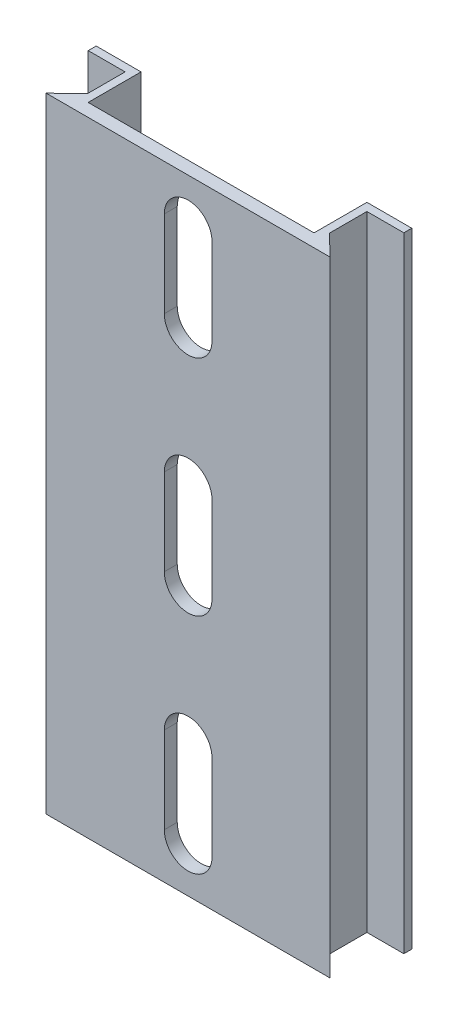
ISO-10303-21;
HEADER;
FILE_DESCRIPTION(('STEP AP214'),'2;1');
FILE_NAME('part.step','',(''),(''),'','','');
FILE_SCHEMA(('AUTOMOTIVE_DESIGN { 1 0 10303 214 1 1 1 1 }'));
ENDSEC;
DATA;
#1=APPLICATION_CONTEXT('core data for automotive mechanical design processes');
#2=APPLICATION_PROTOCOL_DEFINITION('international standard','automotive_design',2000,#1);
#3=PRODUCT_CONTEXT('',#1,'mechanical');
#4=PRODUCT('Part','Part','',(#3));
#5=PRODUCT_RELATED_PRODUCT_CATEGORY('part','',(#4));
#6=PRODUCT_DEFINITION_FORMATION('','',#4);
#7=PRODUCT_DEFINITION_CONTEXT('part definition',#1,'design');
#8=PRODUCT_DEFINITION('design','',#6,#7);
#9=PRODUCT_DEFINITION_SHAPE('','',#8);
#10=(LENGTH_UNIT() NAMED_UNIT(*) SI_UNIT(.MILLI.,.METRE.));
#11=(NAMED_UNIT(*) PLANE_ANGLE_UNIT() SI_UNIT($,.RADIAN.));
#12=(NAMED_UNIT(*) SI_UNIT($,.STERADIAN.) SOLID_ANGLE_UNIT());
#13=UNCERTAINTY_MEASURE_WITH_UNIT(LENGTH_MEASURE(1.E-05),#10,'distance_accuracy_value','');
#14=(GEOMETRIC_REPRESENTATION_CONTEXT(3) GLOBAL_UNCERTAINTY_ASSIGNED_CONTEXT((#13)) GLOBAL_UNIT_ASSIGNED_CONTEXT((#10,
#11,#12)) REPRESENTATION_CONTEXT('',''));
#15=CARTESIAN_POINT('',(0.,0.,0.));
#16=DIRECTION('',(0.,0.,1.));
#17=DIRECTION('',(1.,0.,0.));
#18=AXIS2_PLACEMENT_3D('',#15,#16,#17);
#19=CARTESIAN_POINT('',(0.,34.925,-1.4478));
#20=DIRECTION('',(0.,0.,-1.));
#21=DIRECTION('',(-1.,0.,0.));
#22=AXIS2_PLACEMENT_3D('',#19,#20,#21);
#23=PLANE('',#22);
#24=CARTESIAN_POINT('',(0.,20.167,-1.4478));
#25=DIRECTION('',(0.,0.,-1.));
#26=DIRECTION('',(-1.,0.,0.));
#27=AXIS2_PLACEMENT_3D('',#24,#25,#26);
#28=CIRCLE('',#27,2.667);
#29=CARTESIAN_POINT('',(2.667,20.167,-1.4478));
#30=VERTEX_POINT('',#29);
#31=CARTESIAN_POINT('',(-2.667,20.167,-1.4478));
#32=VERTEX_POINT('',#31);
#33=EDGE_CURVE('E219',#30,#32,#28,.T.);
#34=ORIENTED_EDGE('',*,*,#33,.F.);
#35=DIRECTION('',(0.,-1.,0.));
#36=VECTOR('',#35,1.);
#37=CARTESIAN_POINT('',(2.667,59.925,-1.4478));
#38=LINE('',#37,#36);
#39=CARTESIAN_POINT('',(2.667,29.833,-1.4478));
#40=VERTEX_POINT('',#39);
#41=EDGE_CURVE('E208',#40,#30,#38,.T.);
#42=ORIENTED_EDGE('',*,*,#41,.F.);
#43=CARTESIAN_POINT('',(0.,29.833,-1.4478));
#44=DIRECTION('',(0.,0.,-1.));
#45=DIRECTION('',(-1.,0.,0.));
#46=AXIS2_PLACEMENT_3D('',#43,#44,#45);
#47=CIRCLE('',#46,2.667);
#48=CARTESIAN_POINT('',(-2.667,29.833,-1.4478));
#49=VERTEX_POINT('',#48);
#50=EDGE_CURVE('E49',#49,#40,#47,.T.);
#51=ORIENTED_EDGE('',*,*,#50,.F.);
#52=DIRECTION('',(0.,1.,0.));
#53=VECTOR('',#52,1.);
#54=CARTESIAN_POINT('',(-2.667,59.925,-1.4478));
#55=LINE('',#54,#53);
#56=EDGE_CURVE('E224',#32,#49,#55,.T.);
#57=ORIENTED_EDGE('',*,*,#56,.F.);
#58=EDGE_LOOP('',(#34,#42,#51,#57));
#59=FACE_BOUND('',#58,.T.);
#60=CARTESIAN_POINT('',(0.,-29.833,-1.4478));
#61=DIRECTION('',(0.,0.,-1.));
#62=DIRECTION('',(-1.,0.,0.));
#63=AXIS2_PLACEMENT_3D('',#60,#61,#62);
#64=CIRCLE('',#63,2.667);
#65=CARTESIAN_POINT('',(2.667,-29.833,-1.4478));
#66=VERTEX_POINT('',#65);
#67=CARTESIAN_POINT('',(-2.667,-29.833,-1.4478));
#68=VERTEX_POINT('',#67);
#69=EDGE_CURVE('E257',#66,#68,#64,.T.);
#70=ORIENTED_EDGE('',*,*,#69,.F.);
#71=DIRECTION('',(0.,-1.,0.));
#72=VECTOR('',#71,1.);
#73=CARTESIAN_POINT('',(2.667,9.925,-1.4478));
#74=LINE('',#73,#72);
#75=CARTESIAN_POINT('',(2.667,-20.167,-1.4478));
#76=VERTEX_POINT('',#75);
#77=EDGE_CURVE('E227',#76,#66,#74,.T.);
#78=ORIENTED_EDGE('',*,*,#77,.F.);
#79=CARTESIAN_POINT('',(0.,-20.167,-1.4478));
#80=DIRECTION('',(0.,0.,-1.));
#81=DIRECTION('',(-1.,0.,0.));
#82=AXIS2_PLACEMENT_3D('',#79,#80,#81);
#83=CIRCLE('',#82,2.667);
#84=CARTESIAN_POINT('',(-2.667,-20.167,-1.4478));
#85=VERTEX_POINT('',#84);
#86=EDGE_CURVE('E242',#85,#76,#83,.T.);
#87=ORIENTED_EDGE('',*,*,#86,.F.);
#88=DIRECTION('',(0.,1.,0.));
#89=VECTOR('',#88,1.);
#90=CARTESIAN_POINT('',(-2.667,9.925,-1.4478));
#91=LINE('',#90,#89);
#92=EDGE_CURVE('E249',#68,#85,#91,.T.);
#93=ORIENTED_EDGE('',*,*,#92,.F.);
#94=EDGE_LOOP('',(#70,#78,#87,#93));
#95=FACE_BOUND('',#94,.T.);
#96=CARTESIAN_POINT('',(0.,-4.833,-1.4478));
#97=DIRECTION('',(0.,0.,-1.));
#98=DIRECTION('',(-1.,0.,0.));
#99=AXIS2_PLACEMENT_3D('',#96,#97,#98);
#100=CIRCLE('',#99,2.667);
#101=CARTESIAN_POINT('',(2.667,-4.833,-1.4478));
#102=VERTEX_POINT('',#101);
#103=CARTESIAN_POINT('',(-2.667,-4.833,-1.4478));
#104=VERTEX_POINT('',#103);
#105=EDGE_CURVE('E289',#102,#104,#100,.T.);
#106=ORIENTED_EDGE('',*,*,#105,.F.);
#107=DIRECTION('',(0.,-1.,0.));
#108=VECTOR('',#107,1.);
#109=CARTESIAN_POINT('',(2.667,34.925,-1.4478));
#110=LINE('',#109,#108);
#111=CARTESIAN_POINT('',(2.667,4.833,-1.4478));
#112=VERTEX_POINT('',#111);
#113=EDGE_CURVE('E276',#112,#102,#110,.T.);
#114=ORIENTED_EDGE('',*,*,#113,.F.);
#115=CARTESIAN_POINT('',(0.,4.833,-1.4478));
#116=DIRECTION('',(0.,0.,-1.));
#117=DIRECTION('',(-1.,0.,0.));
#118=AXIS2_PLACEMENT_3D('',#115,#116,#117);
#119=CIRCLE('',#118,2.667);
#120=CARTESIAN_POINT('',(-2.667,4.833,-1.4478));
#121=VERTEX_POINT('',#120);
#122=EDGE_CURVE('E284',#121,#112,#119,.T.);
#123=ORIENTED_EDGE('',*,*,#122,.F.);
#124=DIRECTION('',(0.,1.,0.));
#125=VECTOR('',#124,1.);
#126=CARTESIAN_POINT('',(-2.667,34.925,-1.4478));
#127=LINE('',#126,#125);
#128=EDGE_CURVE('E287',#104,#121,#127,.T.);
#129=ORIENTED_EDGE('',*,*,#128,.F.);
#130=EDGE_LOOP('',(#106,#114,#123,#129));
#131=FACE_BOUND('',#130,.T.);
#132=DIRECTION('',(1.,0.,0.));
#133=VECTOR('',#132,1.);
#134=CARTESIAN_POINT('',(0.,-34.925,-1.4478));
#135=LINE('',#134,#133);
#136=CARTESIAN_POINT('',(-12.6365,-34.925,-1.4478));
#137=VERTEX_POINT('',#136);
#138=CARTESIAN_POINT('',(12.6365,-34.925,-1.4478));
#139=VERTEX_POINT('',#138);
#140=EDGE_CURVE('E291',#137,#139,#135,.T.);
#141=ORIENTED_EDGE('',*,*,#140,.F.);
#142=DIRECTION('',(0.,-1.,0.));
#143=VECTOR('',#142,1.);
#144=CARTESIAN_POINT('',(-12.6365,34.925,-1.4478));
#145=LINE('',#144,#143);
#146=CARTESIAN_POINT('',(-12.6365,34.925,-1.4478));
#147=VERTEX_POINT('',#146);
#148=EDGE_CURVE('E11',#147,#137,#145,.T.);
#149=ORIENTED_EDGE('',*,*,#148,.F.);
#150=DIRECTION('',(1.,0.,0.));
#151=VECTOR('',#150,1.);
#152=CARTESIAN_POINT('',(0.,34.925,-1.4478));
#153=LINE('',#152,#151);
#154=CARTESIAN_POINT('',(12.6365,34.925,-1.4478));
#155=VERTEX_POINT('',#154);
#156=EDGE_CURVE('E292',#147,#155,#153,.T.);
#157=ORIENTED_EDGE('',*,*,#156,.T.);
#158=DIRECTION('',(0.,-1.,0.));
#159=VECTOR('',#158,1.);
#160=CARTESIAN_POINT('',(12.6365,34.925,-1.4478));
#161=LINE('',#160,#159);
#162=EDGE_CURVE('E329',#155,#139,#161,.T.);
#163=ORIENTED_EDGE('',*,*,#162,.T.);
#164=EDGE_LOOP('',(#141,#149,#157,#163));
#165=FACE_BOUND('',#164,.T.);
#166=ADVANCED_FACE('F35',(#59,#95,#131,#165),#23,.T.);
#167=CARTESIAN_POINT('',(-12.6365,34.925,0.));
#168=DIRECTION('',(-1.,0.,0.));
#169=DIRECTION('',(0.,0.,1.));
#170=AXIS2_PLACEMENT_3D('',#167,#168,#169);
#171=PLANE('',#170);
#172=DIRECTION('',(0.,0.,-1.));
#173=VECTOR('',#172,1.);
#174=CARTESIAN_POINT('',(-12.6365,-34.925,0.));
#175=LINE('',#174,#173);
#176=CARTESIAN_POINT('',(-12.6365,-34.925,-7.366));
#177=VERTEX_POINT('',#176);
#178=EDGE_CURVE('E332',#137,#177,#175,.T.);
#179=ORIENTED_EDGE('',*,*,#178,.T.);
#180=DIRECTION('',(0.,-1.,0.));
#181=VECTOR('',#180,1.);
#182=CARTESIAN_POINT('',(-12.6365,34.925,-7.366));
#183=LINE('',#182,#181);
#184=CARTESIAN_POINT('',(-12.6365,34.925,-7.366));
#185=VERTEX_POINT('',#184);
#186=EDGE_CURVE('E42',#185,#177,#183,.T.);
#187=ORIENTED_EDGE('',*,*,#186,.F.);
#188=DIRECTION('',(0.,0.,-1.));
#189=VECTOR('',#188,1.);
#190=CARTESIAN_POINT('',(-12.6365,34.925,0.));
#191=LINE('',#190,#189);
#192=EDGE_CURVE('E295',#147,#185,#191,.T.);
#193=ORIENTED_EDGE('',*,*,#192,.F.);
#194=ORIENTED_EDGE('',*,*,#148,.T.);
#195=EDGE_LOOP('',(#179,#187,#193,#194));
#196=FACE_BOUND('',#195,.T.);
#197=ADVANCED_FACE('F421',(#196),#171,.F.);
#198=CARTESIAN_POINT('',(0.,34.925,-7.366));
#199=DIRECTION('',(0.,0.,1.));
#200=DIRECTION('',(1.,0.,0.));
#201=AXIS2_PLACEMENT_3D('',#198,#199,#200);
#202=PLANE('',#201);
#203=DIRECTION('',(-1.,0.,0.));
#204=VECTOR('',#203,1.);
#205=CARTESIAN_POINT('',(0.,-34.925,-7.366));
#206=LINE('',#205,#204);
#207=CARTESIAN_POINT('',(-17.653,-34.925,-7.366));
#208=VERTEX_POINT('',#207);
#209=EDGE_CURVE('E334',#177,#208,#206,.T.);
#210=ORIENTED_EDGE('',*,*,#209,.T.);
#211=DIRECTION('',(0.,-1.,0.));
#212=VECTOR('',#211,1.);
#213=CARTESIAN_POINT('',(-17.653,34.925,-7.366));
#214=LINE('',#213,#212);
#215=CARTESIAN_POINT('',(-17.653,34.925,-7.366));
#216=VERTEX_POINT('',#215);
#217=EDGE_CURVE('E389',#216,#208,#214,.T.);
#218=ORIENTED_EDGE('',*,*,#217,.F.);
#219=DIRECTION('',(-1.,0.,0.));
#220=VECTOR('',#219,1.);
#221=CARTESIAN_POINT('',(0.,34.925,-7.366));
#222=LINE('',#221,#220);
#223=EDGE_CURVE('E298',#185,#216,#222,.T.);
#224=ORIENTED_EDGE('',*,*,#223,.F.);
#225=ORIENTED_EDGE('',*,*,#186,.T.);
#226=EDGE_LOOP('',(#210,#218,#224,#225));
#227=FACE_BOUND('',#226,.T.);
#228=ADVANCED_FACE('F396',(#227),#202,.F.);
#229=CARTESIAN_POINT('',(-17.653,34.925,0.));
#230=DIRECTION('',(1.,0.,0.));
#231=DIRECTION('',(0.,0.,-1.));
#232=AXIS2_PLACEMENT_3D('',#229,#230,#231);
#233=PLANE('',#232);
#234=DIRECTION('',(0.,0.,1.));
#235=VECTOR('',#234,1.);
#236=CARTESIAN_POINT('',(-17.653,-34.925,0.));
#237=LINE('',#236,#235);
#238=CARTESIAN_POINT('',(-17.653,-34.925,-6.477));
#239=VERTEX_POINT('',#238);
#240=EDGE_CURVE('E336',#208,#239,#237,.T.);
#241=ORIENTED_EDGE('',*,*,#240,.T.);
#242=DIRECTION('',(0.,-1.,0.));
#243=VECTOR('',#242,1.);
#244=CARTESIAN_POINT('',(-17.653,34.925,-6.477));
#245=LINE('',#244,#243);
#246=CARTESIAN_POINT('',(-17.653,34.925,-6.477));
#247=VERTEX_POINT('',#246);
#248=EDGE_CURVE('E386',#247,#239,#245,.T.);
#249=ORIENTED_EDGE('',*,*,#248,.F.);
#250=DIRECTION('',(0.,0.,1.));
#251=VECTOR('',#250,1.);
#252=CARTESIAN_POINT('',(-17.653,34.925,0.));
#253=LINE('',#252,#251);
#254=EDGE_CURVE('E300',#216,#247,#253,.T.);
#255=ORIENTED_EDGE('',*,*,#254,.F.);
#256=ORIENTED_EDGE('',*,*,#217,.T.);
#257=EDGE_LOOP('',(#241,#249,#255,#256));
#258=FACE_BOUND('',#257,.T.);
#259=ADVANCED_FACE('F409',(#258),#233,.F.);
#260=CARTESIAN_POINT('',(0.,34.925,-6.477));
#261=DIRECTION('',(0.,0.,-1.));
#262=DIRECTION('',(-1.,0.,0.));
#263=AXIS2_PLACEMENT_3D('',#260,#261,#262);
#264=PLANE('',#263);
#265=DIRECTION('',(1.,0.,0.));
#266=VECTOR('',#265,1.);
#267=CARTESIAN_POINT('',(0.,-34.925,-6.477));
#268=LINE('',#267,#266);
#269=CARTESIAN_POINT('',(-13.5255,-34.925,-6.477));
#270=VERTEX_POINT('',#269);
#271=EDGE_CURVE('E338',#239,#270,#268,.T.);
#272=ORIENTED_EDGE('',*,*,#271,.T.);
#273=DIRECTION('',(0.,-1.,0.));
#274=VECTOR('',#273,1.);
#275=CARTESIAN_POINT('',(-13.5255,34.925,-6.477));
#276=LINE('',#275,#274);
#277=CARTESIAN_POINT('',(-13.5255,34.925,-6.477));
#278=VERTEX_POINT('',#277);
#279=EDGE_CURVE('E383',#278,#270,#276,.T.);
#280=ORIENTED_EDGE('',*,*,#279,.F.);
#281=DIRECTION('',(1.,0.,0.));
#282=VECTOR('',#281,1.);
#283=CARTESIAN_POINT('',(0.,34.925,-6.477));
#284=LINE('',#283,#282);
#285=EDGE_CURVE('E302',#247,#278,#284,.T.);
#286=ORIENTED_EDGE('',*,*,#285,.F.);
#287=ORIENTED_EDGE('',*,*,#248,.T.);
#288=EDGE_LOOP('',(#272,#280,#286,#287));
#289=FACE_BOUND('',#288,.T.);
#290=ADVANCED_FACE('F413',(#289),#264,.F.);
#291=CARTESIAN_POINT('',(-13.5255,34.925,0.));
#292=DIRECTION('',(1.,0.,0.));
#293=DIRECTION('',(0.,0.,-1.));
#294=AXIS2_PLACEMENT_3D('',#291,#292,#293);
#295=PLANE('',#294);
#296=DIRECTION('',(0.,0.,1.));
#297=VECTOR('',#296,1.);
#298=CARTESIAN_POINT('',(-13.5255,-34.925,0.));
#299=LINE('',#298,#297);
#300=CARTESIAN_POINT('',(-13.5255,-34.925,-2.286));
#301=VERTEX_POINT('',#300);
#302=EDGE_CURVE('E340',#270,#301,#299,.T.);
#303=ORIENTED_EDGE('',*,*,#302,.T.);
#304=DIRECTION('',(0.,-1.,0.));
#305=VECTOR('',#304,1.);
#306=CARTESIAN_POINT('',(-13.5255,34.925,-2.286));
#307=LINE('',#306,#305);
#308=CARTESIAN_POINT('',(-13.5255,34.925,-2.286));
#309=VERTEX_POINT('',#308);
#310=EDGE_CURVE('E380',#309,#301,#307,.T.);
#311=ORIENTED_EDGE('',*,*,#310,.F.);
#312=DIRECTION('',(0.,0.,1.));
#313=VECTOR('',#312,1.);
#314=CARTESIAN_POINT('',(-13.5255,34.925,0.));
#315=LINE('',#314,#313);
#316=EDGE_CURVE('E304',#278,#309,#315,.T.);
#317=ORIENTED_EDGE('',*,*,#316,.F.);
#318=ORIENTED_EDGE('',*,*,#279,.T.);
#319=EDGE_LOOP('',(#303,#311,#317,#318));
#320=FACE_BOUND('',#319,.T.);
#321=ADVANCED_FACE('F456',(#320),#295,.F.);
#322=CARTESIAN_POINT('',(-7.72007504690431,34.925,-7.93452157598499));
#323=DIRECTION('',(0.697354959803454,0.,0.716725930909106));
#324=DIRECTION('',(0.716725930909106,0.,-0.697354959803454));
#325=AXIS2_PLACEMENT_3D('',#322,#323,#324);
#326=PLANE('',#325);
#327=DIRECTION('',(-0.716725930909106,0.,0.697354959803454));
#328=VECTOR('',#327,1.);
#329=CARTESIAN_POINT('',(-7.72007504690431,-34.925,-7.93452157598499));
#330=LINE('',#329,#328);
#331=CARTESIAN_POINT('',(-15.875,-34.925,0.));
#332=VERTEX_POINT('',#331);
#333=EDGE_CURVE('E342',#301,#332,#330,.T.);
#334=ORIENTED_EDGE('',*,*,#333,.T.);
#335=DIRECTION('',(0.,-1.,0.));
#336=VECTOR('',#335,1.);
#337=CARTESIAN_POINT('',(-15.875,34.925,0.));
#338=LINE('',#337,#336);
#339=CARTESIAN_POINT('',(-15.875,34.925,0.));
#340=VERTEX_POINT('',#339);
#341=EDGE_CURVE('E378',#340,#332,#338,.T.);
#342=ORIENTED_EDGE('',*,*,#341,.F.);
#343=DIRECTION('',(-0.716725930909106,0.,0.697354959803454));
#344=VECTOR('',#343,1.);
#345=CARTESIAN_POINT('',(-7.72007504690431,34.925,-7.93452157598499));
#346=LINE('',#345,#344);
#347=EDGE_CURVE('E306',#309,#340,#346,.T.);
#348=ORIENTED_EDGE('',*,*,#347,.F.);
#349=ORIENTED_EDGE('',*,*,#310,.T.);
#350=EDGE_LOOP('',(#334,#342,#348,#349));
#351=FACE_BOUND('',#350,.T.);
#352=ADVANCED_FACE('F454',(#351),#326,.F.);
#353=CARTESIAN_POINT('',(0.,34.925,0.));
#354=DIRECTION('',(0.,0.,1.));
#355=DIRECTION('',(1.,0.,0.));
#356=AXIS2_PLACEMENT_3D('',#353,#354,#355);
#357=PLANE('',#356);
#358=CARTESIAN_POINT('',(0.,20.167,0.));
#359=DIRECTION('',(0.,0.,1.));
#360=DIRECTION('',(1.,0.,0.));
#361=AXIS2_PLACEMENT_3D('',#358,#359,#360);
#362=CIRCLE('',#361,2.667);
#363=CARTESIAN_POINT('',(-2.667,20.167,0.));
#364=VERTEX_POINT('',#363);
#365=CARTESIAN_POINT('',(2.667,20.167,0.));
#366=VERTEX_POINT('',#365);
#367=EDGE_CURVE('E57',#364,#366,#362,.T.);
#368=ORIENTED_EDGE('',*,*,#367,.F.);
#369=DIRECTION('',(0.,-1.,0.));
#370=VECTOR('',#369,1.);
#371=CARTESIAN_POINT('',(-2.667,20.167,0.));
#372=LINE('',#371,#370);
#373=CARTESIAN_POINT('',(-2.667,29.833,0.));
#374=VERTEX_POINT('',#373);
#375=EDGE_CURVE('E229',#374,#364,#372,.T.);
#376=ORIENTED_EDGE('',*,*,#375,.F.);
#377=CARTESIAN_POINT('',(0.,29.833,0.));
#378=DIRECTION('',(0.,0.,1.));
#379=DIRECTION('',(1.,0.,0.));
#380=AXIS2_PLACEMENT_3D('',#377,#378,#379);
#381=CIRCLE('',#380,2.667);
#382=CARTESIAN_POINT('',(2.667,29.833,0.));
#383=VERTEX_POINT('',#382);
#384=EDGE_CURVE('E696',#383,#374,#381,.T.);
#385=ORIENTED_EDGE('',*,*,#384,.F.);
#386=DIRECTION('',(0.,1.,0.));
#387=VECTOR('',#386,1.);
#388=CARTESIAN_POINT('',(2.667,20.167,0.));
#389=LINE('',#388,#387);
#390=EDGE_CURVE('E215',#366,#383,#389,.T.);
#391=ORIENTED_EDGE('',*,*,#390,.F.);
#392=EDGE_LOOP('',(#368,#376,#385,#391));
#393=FACE_BOUND('',#392,.T.);
#394=CARTESIAN_POINT('',(0.,-29.833,0.));
#395=DIRECTION('',(0.,0.,1.));
#396=DIRECTION('',(1.,0.,0.));
#397=AXIS2_PLACEMENT_3D('',#394,#395,#396);
#398=CIRCLE('',#397,2.667);
#399=CARTESIAN_POINT('',(-2.667,-29.833,0.));
#400=VERTEX_POINT('',#399);
#401=CARTESIAN_POINT('',(2.667,-29.833,0.));
#402=VERTEX_POINT('',#401);
#403=EDGE_CURVE('E260',#400,#402,#398,.T.);
#404=ORIENTED_EDGE('',*,*,#403,.F.);
#405=DIRECTION('',(0.,-1.,0.));
#406=VECTOR('',#405,1.);
#407=CARTESIAN_POINT('',(-2.667,-29.833,0.));
#408=LINE('',#407,#406);
#409=CARTESIAN_POINT('',(-2.667,-20.167,0.));
#410=VERTEX_POINT('',#409);
#411=EDGE_CURVE('E252',#410,#400,#408,.T.);
#412=ORIENTED_EDGE('',*,*,#411,.F.);
#413=CARTESIAN_POINT('',(0.,-20.167,0.));
#414=DIRECTION('',(0.,0.,1.));
#415=DIRECTION('',(1.,0.,0.));
#416=AXIS2_PLACEMENT_3D('',#413,#414,#415);
#417=CIRCLE('',#416,2.667);
#418=CARTESIAN_POINT('',(2.667,-20.167,0.));
#419=VERTEX_POINT('',#418);
#420=EDGE_CURVE('E244',#419,#410,#417,.T.);
#421=ORIENTED_EDGE('',*,*,#420,.F.);
#422=DIRECTION('',(0.,1.,0.));
#423=VECTOR('',#422,1.);
#424=CARTESIAN_POINT('',(2.667,-29.833,0.));
#425=LINE('',#424,#423);
#426=EDGE_CURVE('E234',#402,#419,#425,.T.);
#427=ORIENTED_EDGE('',*,*,#426,.F.);
#428=EDGE_LOOP('',(#404,#412,#421,#427));
#429=FACE_BOUND('',#428,.T.);
#430=CARTESIAN_POINT('',(0.,-4.833,0.));
#431=DIRECTION('',(0.,0.,1.));
#432=DIRECTION('',(1.,0.,0.));
#433=AXIS2_PLACEMENT_3D('',#430,#431,#432);
#434=CIRCLE('',#433,2.667);
#435=CARTESIAN_POINT('',(-2.667,-4.833,0.));
#436=VERTEX_POINT('',#435);
#437=CARTESIAN_POINT('',(2.667,-4.833,0.));
#438=VERTEX_POINT('',#437);
#439=EDGE_CURVE('E262',#436,#438,#434,.T.);
#440=ORIENTED_EDGE('',*,*,#439,.F.);
#441=DIRECTION('',(0.,-1.,0.));
#442=VECTOR('',#441,1.);
#443=CARTESIAN_POINT('',(-2.667,-4.833,0.));
#444=LINE('',#443,#442);
#445=CARTESIAN_POINT('',(-2.667,4.833,0.));
#446=VERTEX_POINT('',#445);
#447=EDGE_CURVE('E270',#446,#436,#444,.T.);
#448=ORIENTED_EDGE('',*,*,#447,.F.);
#449=CARTESIAN_POINT('',(0.,4.833,0.));
#450=DIRECTION('',(0.,0.,1.));
#451=DIRECTION('',(1.,0.,0.));
#452=AXIS2_PLACEMENT_3D('',#449,#450,#451);
#453=CIRCLE('',#452,2.667);
#454=CARTESIAN_POINT('',(2.667,4.833,0.));
#455=VERTEX_POINT('',#454);
#456=EDGE_CURVE('E267',#455,#446,#453,.T.);
#457=ORIENTED_EDGE('',*,*,#456,.F.);
#458=DIRECTION('',(0.,1.,0.));
#459=VECTOR('',#458,1.);
#460=CARTESIAN_POINT('',(2.667,-4.833,0.));
#461=LINE('',#460,#459);
#462=EDGE_CURVE('E264',#438,#455,#461,.T.);
#463=ORIENTED_EDGE('',*,*,#462,.F.);
#464=EDGE_LOOP('',(#440,#448,#457,#463));
#465=FACE_BOUND('',#464,.T.);
#466=DIRECTION('',(-1.,0.,0.));
#467=VECTOR('',#466,1.);
#468=CARTESIAN_POINT('',(0.,-34.925,0.));
#469=LINE('',#468,#467);
#470=CARTESIAN_POINT('',(15.875,-34.925,0.));
#471=VERTEX_POINT('',#470);
#472=EDGE_CURVE('E345',#471,#332,#469,.T.);
#473=ORIENTED_EDGE('',*,*,#472,.F.);
#474=DIRECTION('',(0.,-1.,0.));
#475=VECTOR('',#474,1.);
#476=CARTESIAN_POINT('',(15.875,34.925,0.));
#477=LINE('',#476,#475);
#478=CARTESIAN_POINT('',(15.875,34.925,0.));
#479=VERTEX_POINT('',#478);
#480=EDGE_CURVE('E376',#479,#471,#477,.T.);
#481=ORIENTED_EDGE('',*,*,#480,.F.);
#482=DIRECTION('',(-1.,0.,0.));
#483=VECTOR('',#482,1.);
#484=CARTESIAN_POINT('',(0.,34.925,0.));
#485=LINE('',#484,#483);
#486=EDGE_CURVE('E308',#479,#340,#485,.T.);
#487=ORIENTED_EDGE('',*,*,#486,.T.);
#488=ORIENTED_EDGE('',*,*,#341,.T.);
#489=EDGE_LOOP('',(#473,#481,#487,#488));
#490=FACE_BOUND('',#489,.T.);
#491=ADVANCED_FACE('F450',(#393,#429,#465,#490),#357,.T.);
#492=CARTESIAN_POINT('',(7.72007504690431,34.925,-7.93452157598499));
#493=DIRECTION('',(0.697354959803454,0.,-0.716725930909106));
#494=DIRECTION('',(-0.716725930909106,0.,-0.697354959803454));
#495=AXIS2_PLACEMENT_3D('',#492,#493,#494);
#496=PLANE('',#495);
#497=DIRECTION('',(0.716725930909106,0.,0.697354959803454));
#498=VECTOR('',#497,1.);
#499=CARTESIAN_POINT('',(7.72007504690431,-34.925,-7.93452157598499));
#500=LINE('',#499,#498);
#501=CARTESIAN_POINT('',(13.5255,-34.925,-2.286));
#502=VERTEX_POINT('',#501);
#503=EDGE_CURVE('E348',#502,#471,#500,.T.);
#504=ORIENTED_EDGE('',*,*,#503,.F.);
#505=DIRECTION('',(0.,-1.,0.));
#506=VECTOR('',#505,1.);
#507=CARTESIAN_POINT('',(13.5255,34.925,-2.286));
#508=LINE('',#507,#506);
#509=CARTESIAN_POINT('',(13.5255,34.925,-2.286));
#510=VERTEX_POINT('',#509);
#511=EDGE_CURVE('E374',#510,#502,#508,.T.);
#512=ORIENTED_EDGE('',*,*,#511,.F.);
#513=DIRECTION('',(0.716725930909106,0.,0.697354959803454));
#514=VECTOR('',#513,1.);
#515=CARTESIAN_POINT('',(7.72007504690431,34.925,-7.93452157598499));
#516=LINE('',#515,#514);
#517=EDGE_CURVE('E311',#510,#479,#516,.T.);
#518=ORIENTED_EDGE('',*,*,#517,.T.);
#519=ORIENTED_EDGE('',*,*,#480,.T.);
#520=EDGE_LOOP('',(#504,#512,#518,#519));
#521=FACE_BOUND('',#520,.T.);
#522=ADVANCED_FACE('F446',(#521),#496,.T.);
#523=CARTESIAN_POINT('',(13.5255,34.925,0.));
#524=DIRECTION('',(1.,0.,0.));
#525=DIRECTION('',(0.,0.,-1.));
#526=AXIS2_PLACEMENT_3D('',#523,#524,#525);
#527=PLANE('',#526);
#528=DIRECTION('',(0.,0.,1.));
#529=VECTOR('',#528,1.);
#530=CARTESIAN_POINT('',(13.5255,-34.925,0.));
#531=LINE('',#530,#529);
#532=CARTESIAN_POINT('',(13.5255,-34.925,-6.477));
#533=VERTEX_POINT('',#532);
#534=EDGE_CURVE('E351',#533,#502,#531,.T.);
#535=ORIENTED_EDGE('',*,*,#534,.F.);
#536=DIRECTION('',(0.,-1.,0.));
#537=VECTOR('',#536,1.);
#538=CARTESIAN_POINT('',(13.5255,34.925,-6.477));
#539=LINE('',#538,#537);
#540=CARTESIAN_POINT('',(13.5255,34.925,-6.477));
#541=VERTEX_POINT('',#540);
#542=EDGE_CURVE('E372',#541,#533,#539,.T.);
#543=ORIENTED_EDGE('',*,*,#542,.F.);
#544=DIRECTION('',(0.,0.,1.));
#545=VECTOR('',#544,1.);
#546=CARTESIAN_POINT('',(13.5255,34.925,0.));
#547=LINE('',#546,#545);
#548=EDGE_CURVE('E314',#541,#510,#547,.T.);
#549=ORIENTED_EDGE('',*,*,#548,.T.);
#550=ORIENTED_EDGE('',*,*,#511,.T.);
#551=EDGE_LOOP('',(#535,#543,#549,#550));
#552=FACE_BOUND('',#551,.T.);
#553=ADVANCED_FACE('F441',(#552),#527,.T.);
#554=CARTESIAN_POINT('',(0.,34.925,-6.477));
#555=DIRECTION('',(0.,0.,1.));
#556=DIRECTION('',(1.,0.,0.));
#557=AXIS2_PLACEMENT_3D('',#554,#555,#556);
#558=PLANE('',#557);
#559=DIRECTION('',(-1.,0.,0.));
#560=VECTOR('',#559,1.);
#561=CARTESIAN_POINT('',(0.,-34.925,-6.477));
#562=LINE('',#561,#560);
#563=CARTESIAN_POINT('',(17.653,-34.925,-6.477));
#564=VERTEX_POINT('',#563);
#565=EDGE_CURVE('E354',#564,#533,#562,.T.);
#566=ORIENTED_EDGE('',*,*,#565,.F.);
#567=DIRECTION('',(0.,-1.,0.));
#568=VECTOR('',#567,1.);
#569=CARTESIAN_POINT('',(17.653,34.925,-6.477));
#570=LINE('',#569,#568);
#571=CARTESIAN_POINT('',(17.653,34.925,-6.477));
#572=VERTEX_POINT('',#571);
#573=EDGE_CURVE('E370',#572,#564,#570,.T.);
#574=ORIENTED_EDGE('',*,*,#573,.F.);
#575=DIRECTION('',(-1.,0.,0.));
#576=VECTOR('',#575,1.);
#577=CARTESIAN_POINT('',(0.,34.925,-6.477));
#578=LINE('',#577,#576);
#579=EDGE_CURVE('E317',#572,#541,#578,.T.);
#580=ORIENTED_EDGE('',*,*,#579,.T.);
#581=ORIENTED_EDGE('',*,*,#542,.T.);
#582=EDGE_LOOP('',(#566,#574,#580,#581));
#583=FACE_BOUND('',#582,.T.);
#584=ADVANCED_FACE('F437',(#583),#558,.T.);
#585=CARTESIAN_POINT('',(17.653,34.925,0.));
#586=DIRECTION('',(1.,0.,0.));
#587=DIRECTION('',(0.,0.,-1.));
#588=AXIS2_PLACEMENT_3D('',#585,#586,#587);
#589=PLANE('',#588);
#590=DIRECTION('',(0.,0.,1.));
#591=VECTOR('',#590,1.);
#592=CARTESIAN_POINT('',(17.653,-34.925,0.));
#593=LINE('',#592,#591);
#594=CARTESIAN_POINT('',(17.653,-34.925,-7.366));
#595=VERTEX_POINT('',#594);
#596=EDGE_CURVE('E357',#595,#564,#593,.T.);
#597=ORIENTED_EDGE('',*,*,#596,.F.);
#598=DIRECTION('',(0.,-1.,0.));
#599=VECTOR('',#598,1.);
#600=CARTESIAN_POINT('',(17.653,34.925,-7.366));
#601=LINE('',#600,#599);
#602=CARTESIAN_POINT('',(17.653,34.925,-7.366));
#603=VERTEX_POINT('',#602);
#604=EDGE_CURVE('E368',#603,#595,#601,.T.);
#605=ORIENTED_EDGE('',*,*,#604,.F.);
#606=DIRECTION('',(0.,0.,1.));
#607=VECTOR('',#606,1.);
#608=CARTESIAN_POINT('',(17.653,34.925,0.));
#609=LINE('',#608,#607);
#610=EDGE_CURVE('E320',#603,#572,#609,.T.);
#611=ORIENTED_EDGE('',*,*,#610,.T.);
#612=ORIENTED_EDGE('',*,*,#573,.T.);
#613=EDGE_LOOP('',(#597,#605,#611,#612));
#614=FACE_BOUND('',#613,.T.);
#615=ADVANCED_FACE('F433',(#614),#589,.T.);
#616=CARTESIAN_POINT('',(0.,34.925,-7.366));
#617=DIRECTION('',(0.,0.,-1.));
#618=DIRECTION('',(-1.,0.,0.));
#619=AXIS2_PLACEMENT_3D('',#616,#617,#618);
#620=PLANE('',#619);
#621=DIRECTION('',(1.,0.,0.));
#622=VECTOR('',#621,1.);
#623=CARTESIAN_POINT('',(0.,-34.925,-7.366));
#624=LINE('',#623,#622);
#625=CARTESIAN_POINT('',(12.6365,-34.925,-7.366));
#626=VERTEX_POINT('',#625);
#627=EDGE_CURVE('E360',#626,#595,#624,.T.);
#628=ORIENTED_EDGE('',*,*,#627,.F.);
#629=DIRECTION('',(0.,-1.,0.));
#630=VECTOR('',#629,1.);
#631=CARTESIAN_POINT('',(12.6365,34.925,-7.366));
#632=LINE('',#631,#630);
#633=CARTESIAN_POINT('',(12.6365,34.925,-7.366));
#634=VERTEX_POINT('',#633);
#635=EDGE_CURVE('E366',#634,#626,#632,.T.);
#636=ORIENTED_EDGE('',*,*,#635,.F.);
#637=DIRECTION('',(1.,0.,0.));
#638=VECTOR('',#637,1.);
#639=CARTESIAN_POINT('',(0.,34.925,-7.366));
#640=LINE('',#639,#638);
#641=EDGE_CURVE('E323',#634,#603,#640,.T.);
#642=ORIENTED_EDGE('',*,*,#641,.T.);
#643=ORIENTED_EDGE('',*,*,#604,.T.);
#644=EDGE_LOOP('',(#628,#636,#642,#643));
#645=FACE_BOUND('',#644,.T.);
#646=ADVANCED_FACE('F429',(#645),#620,.T.);
#647=CARTESIAN_POINT('',(12.6365,34.925,0.));
#648=DIRECTION('',(-1.,0.,0.));
#649=DIRECTION('',(0.,0.,1.));
#650=AXIS2_PLACEMENT_3D('',#647,#648,#649);
#651=PLANE('',#650);
#652=DIRECTION('',(0.,0.,-1.));
#653=VECTOR('',#652,1.);
#654=CARTESIAN_POINT('',(12.6365,-34.925,0.));
#655=LINE('',#654,#653);
#656=EDGE_CURVE('E296',#139,#626,#655,.T.);
#657=ORIENTED_EDGE('',*,*,#656,.F.);
#658=ORIENTED_EDGE('',*,*,#162,.F.);
#659=DIRECTION('',(0.,0.,-1.));
#660=VECTOR('',#659,1.);
#661=CARTESIAN_POINT('',(12.6365,34.925,0.));
#662=LINE('',#661,#660);
#663=EDGE_CURVE('E326',#155,#634,#662,.T.);
#664=ORIENTED_EDGE('',*,*,#663,.T.);
#665=ORIENTED_EDGE('',*,*,#635,.T.);
#666=EDGE_LOOP('',(#657,#658,#664,#665));
#667=FACE_BOUND('',#666,.T.);
#668=ADVANCED_FACE('F425',(#667),#651,.T.);
#669=CARTESIAN_POINT('',(0.,34.925,0.));
#670=DIRECTION('',(0.,1.,0.));
#671=DIRECTION('',(0.,0.,1.));
#672=AXIS2_PLACEMENT_3D('',#669,#670,#671);
#673=PLANE('',#672);
#674=ORIENTED_EDGE('',*,*,#156,.F.);
#675=ORIENTED_EDGE('',*,*,#192,.T.);
#676=ORIENTED_EDGE('',*,*,#223,.T.);
#677=ORIENTED_EDGE('',*,*,#254,.T.);
#678=ORIENTED_EDGE('',*,*,#285,.T.);
#679=ORIENTED_EDGE('',*,*,#316,.T.);
#680=ORIENTED_EDGE('',*,*,#347,.T.);
#681=ORIENTED_EDGE('',*,*,#486,.F.);
#682=ORIENTED_EDGE('',*,*,#517,.F.);
#683=ORIENTED_EDGE('',*,*,#548,.F.);
#684=ORIENTED_EDGE('',*,*,#579,.F.);
#685=ORIENTED_EDGE('',*,*,#610,.F.);
#686=ORIENTED_EDGE('',*,*,#641,.F.);
#687=ORIENTED_EDGE('',*,*,#663,.F.);
#688=EDGE_LOOP('',(#674,#675,#676,#677,#678,#679,#680,#681,#682,#683,#684,#685,#686,#687));
#689=FACE_BOUND('',#688,.T.);
#690=ADVANCED_FACE('F418',(#689),#673,.T.);
#691=CARTESIAN_POINT('',(0.,-34.925,0.));
#692=DIRECTION('',(0.,1.,0.));
#693=DIRECTION('',(0.,0.,1.));
#694=AXIS2_PLACEMENT_3D('',#691,#692,#693);
#695=PLANE('',#694);
#696=ORIENTED_EDGE('',*,*,#140,.T.);
#697=ORIENTED_EDGE('',*,*,#656,.T.);
#698=ORIENTED_EDGE('',*,*,#627,.T.);
#699=ORIENTED_EDGE('',*,*,#596,.T.);
#700=ORIENTED_EDGE('',*,*,#565,.T.);
#701=ORIENTED_EDGE('',*,*,#534,.T.);
#702=ORIENTED_EDGE('',*,*,#503,.T.);
#703=ORIENTED_EDGE('',*,*,#472,.T.);
#704=ORIENTED_EDGE('',*,*,#333,.F.);
#705=ORIENTED_EDGE('',*,*,#302,.F.);
#706=ORIENTED_EDGE('',*,*,#271,.F.);
#707=ORIENTED_EDGE('',*,*,#240,.F.);
#708=ORIENTED_EDGE('',*,*,#209,.F.);
#709=ORIENTED_EDGE('',*,*,#178,.F.);
#710=EDGE_LOOP('',(#696,#697,#698,#699,#700,#701,#702,#703,#704,#705,#706,#707,#708,#709));
#711=FACE_BOUND('',#710,.T.);
#712=ADVANCED_FACE('F403',(#711),#695,.F.);
#713=CARTESIAN_POINT('',(0.,-4.833,-7.366));
#714=DIRECTION('',(0.,0.,1.));
#715=DIRECTION('',(1.,0.,0.));
#716=AXIS2_PLACEMENT_3D('',#713,#714,#715);
#717=CYLINDRICAL_SURFACE('',#716,2.667);
#718=ORIENTED_EDGE('',*,*,#105,.T.);
#719=DIRECTION('',(0.,0.,1.));
#720=VECTOR('',#719,1.);
#721=CARTESIAN_POINT('',(-2.667,-4.833,-7.366));
#722=LINE('',#721,#720);
#723=EDGE_CURVE('E274',#104,#436,#722,.T.);
#724=ORIENTED_EDGE('',*,*,#723,.T.);
#725=ORIENTED_EDGE('',*,*,#439,.T.);
#726=DIRECTION('',(0.,0.,1.));
#727=VECTOR('',#726,1.);
#728=CARTESIAN_POINT('',(2.667,-4.833,-7.366));
#729=LINE('',#728,#727);
#730=EDGE_CURVE('E273',#102,#438,#729,.T.);
#731=ORIENTED_EDGE('',*,*,#730,.F.);
#732=EDGE_LOOP('',(#718,#724,#725,#731));
#733=FACE_BOUND('',#732,.T.);
#734=ADVANCED_FACE('F562',(#733),#717,.F.);
#735=CARTESIAN_POINT('',(-2.667,-4.833,-7.366));
#736=DIRECTION('',(-1.,0.,0.));
#737=DIRECTION('',(0.,0.,1.));
#738=AXIS2_PLACEMENT_3D('',#735,#736,#737);
#739=PLANE('',#738);
#740=ORIENTED_EDGE('',*,*,#128,.T.);
#741=DIRECTION('',(0.,0.,1.));
#742=VECTOR('',#741,1.);
#743=CARTESIAN_POINT('',(-2.667,4.833,-7.366));
#744=LINE('',#743,#742);
#745=EDGE_CURVE('E277',#121,#446,#744,.T.);
#746=ORIENTED_EDGE('',*,*,#745,.T.);
#747=ORIENTED_EDGE('',*,*,#447,.T.);
#748=ORIENTED_EDGE('',*,*,#723,.F.);
#749=EDGE_LOOP('',(#740,#746,#747,#748));
#750=FACE_BOUND('',#749,.T.);
#751=ADVANCED_FACE('F571',(#750),#739,.F.);
#752=CARTESIAN_POINT('',(0.,4.833,-7.366));
#753=DIRECTION('',(0.,0.,1.));
#754=DIRECTION('',(1.,0.,0.));
#755=AXIS2_PLACEMENT_3D('',#752,#753,#754);
#756=CYLINDRICAL_SURFACE('',#755,2.667);
#757=ORIENTED_EDGE('',*,*,#122,.T.);
#758=DIRECTION('',(0.,0.,1.));
#759=VECTOR('',#758,1.);
#760=CARTESIAN_POINT('',(2.667,4.833,-7.366));
#761=LINE('',#760,#759);
#762=EDGE_CURVE('E279',#112,#455,#761,.T.);
#763=ORIENTED_EDGE('',*,*,#762,.T.);
#764=ORIENTED_EDGE('',*,*,#456,.T.);
#765=ORIENTED_EDGE('',*,*,#745,.F.);
#766=EDGE_LOOP('',(#757,#763,#764,#765));
#767=FACE_BOUND('',#766,.T.);
#768=ADVANCED_FACE('F581',(#767),#756,.F.);
#769=CARTESIAN_POINT('',(2.667,-4.833,-7.366));
#770=DIRECTION('',(1.,0.,0.));
#771=DIRECTION('',(0.,0.,-1.));
#772=AXIS2_PLACEMENT_3D('',#769,#770,#771);
#773=PLANE('',#772);
#774=ORIENTED_EDGE('',*,*,#113,.T.);
#775=ORIENTED_EDGE('',*,*,#730,.T.);
#776=ORIENTED_EDGE('',*,*,#462,.T.);
#777=ORIENTED_EDGE('',*,*,#762,.F.);
#778=EDGE_LOOP('',(#774,#775,#776,#777));
#779=FACE_BOUND('',#778,.T.);
#780=ADVANCED_FACE('F591',(#779),#773,.F.);
#781=CARTESIAN_POINT('',(0.,-29.833,-7.366));
#782=DIRECTION('',(0.,0.,1.));
#783=DIRECTION('',(1.,0.,0.));
#784=AXIS2_PLACEMENT_3D('',#781,#782,#783);
#785=CYLINDRICAL_SURFACE('',#784,2.667);
#786=ORIENTED_EDGE('',*,*,#69,.T.);
#787=DIRECTION('',(0.,0.,1.));
#788=VECTOR('',#787,1.);
#789=CARTESIAN_POINT('',(-2.667,-29.833,-7.366));
#790=LINE('',#789,#788);
#791=EDGE_CURVE('E254',#68,#400,#790,.T.);
#792=ORIENTED_EDGE('',*,*,#791,.T.);
#793=ORIENTED_EDGE('',*,*,#403,.T.);
#794=DIRECTION('',(0.,0.,1.));
#795=VECTOR('',#794,1.);
#796=CARTESIAN_POINT('',(2.667,-29.833,-7.366));
#797=LINE('',#796,#795);
#798=EDGE_CURVE('E236',#66,#402,#797,.T.);
#799=ORIENTED_EDGE('',*,*,#798,.F.);
#800=EDGE_LOOP('',(#786,#792,#793,#799));
#801=FACE_BOUND('',#800,.T.);
#802=ADVANCED_FACE('F600',(#801),#785,.F.);
#803=CARTESIAN_POINT('',(-2.667,-29.833,-7.366));
#804=DIRECTION('',(-1.,0.,0.));
#805=DIRECTION('',(0.,0.,1.));
#806=AXIS2_PLACEMENT_3D('',#803,#804,#805);
#807=PLANE('',#806);
#808=ORIENTED_EDGE('',*,*,#92,.T.);
#809=DIRECTION('',(0.,0.,1.));
#810=VECTOR('',#809,1.);
#811=CARTESIAN_POINT('',(-2.667,-20.167,-7.366));
#812=LINE('',#811,#810);
#813=EDGE_CURVE('E246',#85,#410,#812,.T.);
#814=ORIENTED_EDGE('',*,*,#813,.T.);
#815=ORIENTED_EDGE('',*,*,#411,.T.);
#816=ORIENTED_EDGE('',*,*,#791,.F.);
#817=EDGE_LOOP('',(#808,#814,#815,#816));
#818=FACE_BOUND('',#817,.T.);
#819=ADVANCED_FACE('F623',(#818),#807,.F.);
#820=CARTESIAN_POINT('',(0.,-20.167,-7.366));
#821=DIRECTION('',(0.,0.,1.));
#822=DIRECTION('',(1.,0.,0.));
#823=AXIS2_PLACEMENT_3D('',#820,#821,#822);
#824=CYLINDRICAL_SURFACE('',#823,2.667);
#825=ORIENTED_EDGE('',*,*,#86,.T.);
#826=DIRECTION('',(0.,0.,1.));
#827=VECTOR('',#826,1.);
#828=CARTESIAN_POINT('',(2.667,-20.167,-7.366));
#829=LINE('',#828,#827);
#830=EDGE_CURVE('E239',#76,#419,#829,.T.);
#831=ORIENTED_EDGE('',*,*,#830,.T.);
#832=ORIENTED_EDGE('',*,*,#420,.T.);
#833=ORIENTED_EDGE('',*,*,#813,.F.);
#834=EDGE_LOOP('',(#825,#831,#832,#833));
#835=FACE_BOUND('',#834,.T.);
#836=ADVANCED_FACE('F633',(#835),#824,.F.);
#837=CARTESIAN_POINT('',(2.667,-29.833,-7.366));
#838=DIRECTION('',(1.,0.,0.));
#839=DIRECTION('',(0.,0.,-1.));
#840=AXIS2_PLACEMENT_3D('',#837,#838,#839);
#841=PLANE('',#840);
#842=ORIENTED_EDGE('',*,*,#77,.T.);
#843=ORIENTED_EDGE('',*,*,#798,.T.);
#844=ORIENTED_EDGE('',*,*,#426,.T.);
#845=ORIENTED_EDGE('',*,*,#830,.F.);
#846=EDGE_LOOP('',(#842,#843,#844,#845));
#847=FACE_BOUND('',#846,.T.);
#848=ADVANCED_FACE('F643',(#847),#841,.F.);
#849=CARTESIAN_POINT('',(0.,20.167,-7.366));
#850=DIRECTION('',(0.,0.,1.));
#851=DIRECTION('',(1.,0.,0.));
#852=AXIS2_PLACEMENT_3D('',#849,#850,#851);
#853=CYLINDRICAL_SURFACE('',#852,2.667);
#854=ORIENTED_EDGE('',*,*,#33,.T.);
#855=DIRECTION('',(0.,0.,1.));
#856=VECTOR('',#855,1.);
#857=CARTESIAN_POINT('',(-2.667,20.167,-7.366));
#858=LINE('',#857,#856);
#859=EDGE_CURVE('E225',#32,#364,#858,.T.);
#860=ORIENTED_EDGE('',*,*,#859,.T.);
#861=ORIENTED_EDGE('',*,*,#367,.T.);
#862=DIRECTION('',(0.,0.,1.));
#863=VECTOR('',#862,1.);
#864=CARTESIAN_POINT('',(2.667,20.167,-7.366));
#865=LINE('',#864,#863);
#866=EDGE_CURVE('E210',#30,#366,#865,.T.);
#867=ORIENTED_EDGE('',*,*,#866,.F.);
#868=EDGE_LOOP('',(#854,#860,#861,#867));
#869=FACE_BOUND('',#868,.T.);
#870=ADVANCED_FACE('F218',(#869),#853,.F.);
#871=CARTESIAN_POINT('',(-2.667,20.167,-7.366));
#872=DIRECTION('',(-1.,0.,0.));
#873=DIRECTION('',(0.,0.,1.));
#874=AXIS2_PLACEMENT_3D('',#871,#872,#873);
#875=PLANE('',#874);
#876=ORIENTED_EDGE('',*,*,#56,.T.);
#877=DIRECTION('',(0.,0.,1.));
#878=VECTOR('',#877,1.);
#879=CARTESIAN_POINT('',(-2.667,29.833,-7.366));
#880=LINE('',#879,#878);
#881=EDGE_CURVE('E693',#49,#374,#880,.T.);
#882=ORIENTED_EDGE('',*,*,#881,.T.);
#883=ORIENTED_EDGE('',*,*,#375,.T.);
#884=ORIENTED_EDGE('',*,*,#859,.F.);
#885=EDGE_LOOP('',(#876,#882,#883,#884));
#886=FACE_BOUND('',#885,.T.);
#887=ADVANCED_FACE('F662',(#886),#875,.F.);
#888=CARTESIAN_POINT('',(0.,29.833,-7.366));
#889=DIRECTION('',(0.,0.,1.));
#890=DIRECTION('',(1.,0.,0.));
#891=AXIS2_PLACEMENT_3D('',#888,#889,#890);
#892=CYLINDRICAL_SURFACE('',#891,2.667);
#893=ORIENTED_EDGE('',*,*,#50,.T.);
#894=DIRECTION('',(0.,0.,1.));
#895=VECTOR('',#894,1.);
#896=CARTESIAN_POINT('',(2.667,29.833,-7.366));
#897=LINE('',#896,#895);
#898=EDGE_CURVE('E212',#40,#383,#897,.T.);
#899=ORIENTED_EDGE('',*,*,#898,.T.);
#900=ORIENTED_EDGE('',*,*,#384,.T.);
#901=ORIENTED_EDGE('',*,*,#881,.F.);
#902=EDGE_LOOP('',(#893,#899,#900,#901));
#903=FACE_BOUND('',#902,.T.);
#904=ADVANCED_FACE('F671',(#903),#892,.F.);
#905=CARTESIAN_POINT('',(2.667,20.167,-7.366));
#906=DIRECTION('',(1.,0.,0.));
#907=DIRECTION('',(0.,0.,-1.));
#908=AXIS2_PLACEMENT_3D('',#905,#906,#907);
#909=PLANE('',#908);
#910=ORIENTED_EDGE('',*,*,#41,.T.);
#911=ORIENTED_EDGE('',*,*,#866,.T.);
#912=ORIENTED_EDGE('',*,*,#390,.T.);
#913=ORIENTED_EDGE('',*,*,#898,.F.);
#914=EDGE_LOOP('',(#910,#911,#912,#913));
#915=FACE_BOUND('',#914,.T.);
#916=ADVANCED_FACE('F209',(#915),#909,.F.);
#917=CLOSED_SHELL('',(#166,#197,#228,#259,#290,#321,#352,#491,#522,#553,#584,#615,#646,#668,
#690,#712,#734,#751,#768,#780,#802,#819,#836,#848,#870,#887,#904,#916));
#918=MANIFOLD_SOLID_BREP('B2',#917);
#919=ADVANCED_BREP_SHAPE_REPRESENTATION('',(#18,#918),#14);
#920=SHAPE_DEFINITION_REPRESENTATION(#9,#919);
ENDSEC;
END-ISO-10303-21;
